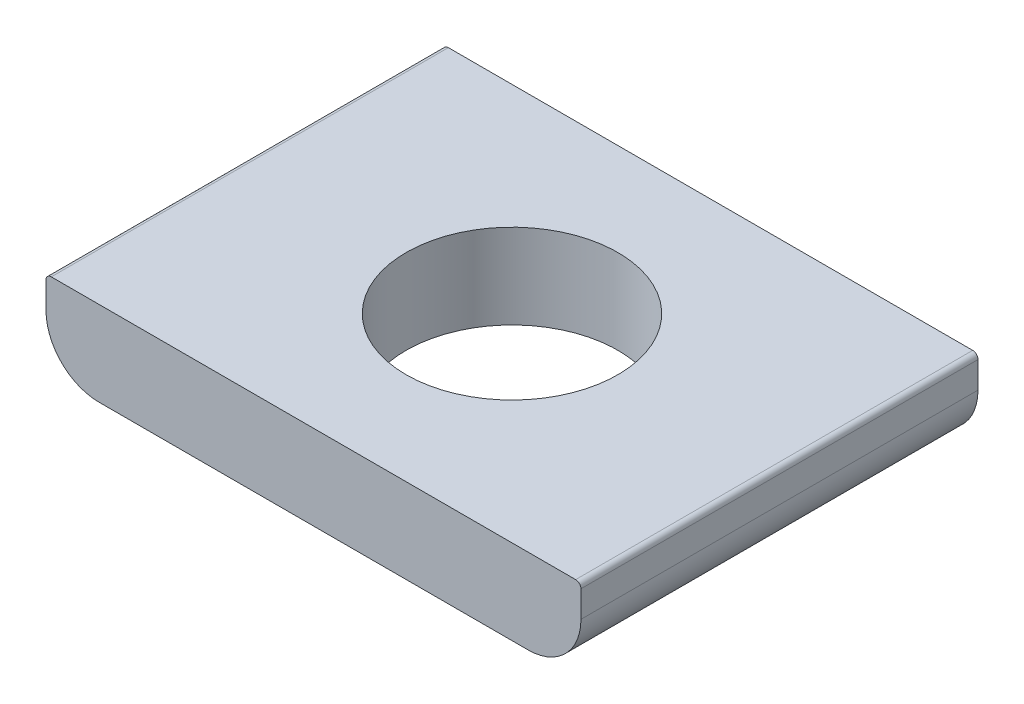
ISO-10303-21;
HEADER;
FILE_DESCRIPTION(('STEP AP214'),'2;1');
FILE_NAME('part.step','',(''),(''),'','','');
FILE_SCHEMA(('AUTOMOTIVE_DESIGN { 1 0 10303 214 1 1 1 1 }'));
ENDSEC;
DATA;
#1=APPLICATION_CONTEXT('core data for automotive mechanical design processes');
#2=APPLICATION_PROTOCOL_DEFINITION('international standard','automotive_design',2000,#1);
#3=PRODUCT_CONTEXT('',#1,'mechanical');
#4=PRODUCT('Part','Part','',(#3));
#5=PRODUCT_RELATED_PRODUCT_CATEGORY('part','',(#4));
#6=PRODUCT_DEFINITION_FORMATION('','',#4);
#7=PRODUCT_DEFINITION_CONTEXT('part definition',#1,'design');
#8=PRODUCT_DEFINITION('design','',#6,#7);
#9=PRODUCT_DEFINITION_SHAPE('','',#8);
#10=(LENGTH_UNIT() NAMED_UNIT(*) SI_UNIT(.MILLI.,.METRE.));
#11=(NAMED_UNIT(*) PLANE_ANGLE_UNIT() SI_UNIT($,.RADIAN.));
#12=(NAMED_UNIT(*) SI_UNIT($,.STERADIAN.) SOLID_ANGLE_UNIT());
#13=UNCERTAINTY_MEASURE_WITH_UNIT(LENGTH_MEASURE(1.E-05),#10,'distance_accuracy_value','');
#14=(GEOMETRIC_REPRESENTATION_CONTEXT(3) GLOBAL_UNCERTAINTY_ASSIGNED_CONTEXT((#13)) GLOBAL_UNIT_ASSIGNED_CONTEXT((#10,
#11,#12)) REPRESENTATION_CONTEXT('',''));
#15=CARTESIAN_POINT('',(0.,0.,0.));
#16=DIRECTION('',(0.,0.,1.));
#17=DIRECTION('',(1.,0.,0.));
#18=AXIS2_PLACEMENT_3D('',#15,#16,#17);
#19=CARTESIAN_POINT('',(-9.905,-0.2,15.));
#20=DIRECTION('',(0.,0.,-1.));
#21=DIRECTION('',(-1.,0.,0.));
#22=AXIS2_PLACEMENT_3D('',#19,#20,#21);
#23=CYLINDRICAL_SURFACE('',#22,0.2);
#24=CARTESIAN_POINT('',(-9.905,-0.2,0.));
#25=DIRECTION('',(0.,0.,1.));
#26=DIRECTION('',(1.,0.,0.));
#27=AXIS2_PLACEMENT_3D('',#24,#25,#26);
#28=CIRCLE('',#27,0.2);
#29=CARTESIAN_POINT('',(-9.905,0.,0.));
#30=VERTEX_POINT('',#29);
#31=CARTESIAN_POINT('',(-10.105,-0.200000000000001,0.));
#32=VERTEX_POINT('',#31);
#33=EDGE_CURVE('E129',#30,#32,#28,.T.);
#34=ORIENTED_EDGE('',*,*,#33,.T.);
#35=DIRECTION('',(0.,0.,-1.));
#36=VECTOR('',#35,1.);
#37=CARTESIAN_POINT('',(-10.105,-0.200000000000001,15.));
#38=LINE('',#37,#36);
#39=CARTESIAN_POINT('',(-10.105,-0.200000000000001,15.));
#40=VERTEX_POINT('',#39);
#41=EDGE_CURVE('E11',#40,#32,#38,.T.);
#42=ORIENTED_EDGE('',*,*,#41,.F.);
#43=CARTESIAN_POINT('',(-9.905,-0.2,15.));
#44=DIRECTION('',(0.,0.,1.));
#45=DIRECTION('',(1.,0.,0.));
#46=AXIS2_PLACEMENT_3D('',#43,#44,#45);
#47=CIRCLE('',#46,0.2);
#48=CARTESIAN_POINT('',(-9.905,0.,15.));
#49=VERTEX_POINT('',#48);
#50=EDGE_CURVE('E144',#49,#40,#47,.T.);
#51=ORIENTED_EDGE('',*,*,#50,.F.);
#52=DIRECTION('',(0.,0.,-1.));
#53=VECTOR('',#52,1.);
#54=CARTESIAN_POINT('',(-9.905,0.,15.));
#55=LINE('',#54,#53);
#56=EDGE_CURVE('E125',#49,#30,#55,.T.);
#57=ORIENTED_EDGE('',*,*,#56,.T.);
#58=EDGE_LOOP('',(#34,#42,#51,#57));
#59=FACE_BOUND('',#58,.T.);
#60=ADVANCED_FACE('F33',(#59),#23,.T.);
#61=CARTESIAN_POINT('',(-10.105,-0.200000000000001,15.));
#62=DIRECTION('',(1.,0.,0.));
#63=DIRECTION('',(0.,0.,-1.));
#64=AXIS2_PLACEMENT_3D('',#61,#62,#63);
#65=PLANE('',#64);
#66=DIRECTION('',(0.,-1.,0.));
#67=VECTOR('',#66,1.);
#68=CARTESIAN_POINT('',(-10.105,-0.200000000000001,0.));
#69=LINE('',#68,#67);
#70=CARTESIAN_POINT('',(-10.105,-1.2,0.));
#71=VERTEX_POINT('',#70);
#72=EDGE_CURVE('E132',#32,#71,#69,.T.);
#73=ORIENTED_EDGE('',*,*,#72,.T.);
#74=DIRECTION('',(0.,0.,-1.));
#75=VECTOR('',#74,1.);
#76=CARTESIAN_POINT('',(-10.105,-1.2,15.));
#77=LINE('',#76,#75);
#78=CARTESIAN_POINT('',(-10.105,-1.2,15.));
#79=VERTEX_POINT('',#78);
#80=EDGE_CURVE('E41',#79,#71,#77,.T.);
#81=ORIENTED_EDGE('',*,*,#80,.F.);
#82=DIRECTION('',(0.,-1.,0.));
#83=VECTOR('',#82,1.);
#84=CARTESIAN_POINT('',(-10.105,-0.200000000000001,15.));
#85=LINE('',#84,#83);
#86=EDGE_CURVE('E92',#40,#79,#85,.T.);
#87=ORIENTED_EDGE('',*,*,#86,.F.);
#88=ORIENTED_EDGE('',*,*,#41,.T.);
#89=EDGE_LOOP('',(#73,#81,#87,#88));
#90=FACE_BOUND('',#89,.T.);
#91=ADVANCED_FACE('F196',(#90),#65,.F.);
#92=CARTESIAN_POINT('',(-8.105,-1.2,15.));
#93=DIRECTION('',(0.,0.,-1.));
#94=DIRECTION('',(-1.,0.,0.));
#95=AXIS2_PLACEMENT_3D('',#92,#93,#94);
#96=CYLINDRICAL_SURFACE('',#95,2.);
#97=CARTESIAN_POINT('',(-8.105,-1.2,0.));
#98=DIRECTION('',(0.,0.,1.));
#99=DIRECTION('',(-1.,0.,0.));
#100=AXIS2_PLACEMENT_3D('',#97,#98,#99);
#101=CIRCLE('',#100,2.);
#102=CARTESIAN_POINT('',(-8.10499999999999,-3.2,0.));
#103=VERTEX_POINT('',#102);
#104=EDGE_CURVE('E135',#71,#103,#101,.T.);
#105=ORIENTED_EDGE('',*,*,#104,.T.);
#106=DIRECTION('',(0.,0.,-1.));
#107=VECTOR('',#106,1.);
#108=CARTESIAN_POINT('',(-8.10499999999999,-3.2,15.));
#109=LINE('',#108,#107);
#110=CARTESIAN_POINT('',(-8.10499999999999,-3.2,15.));
#111=VERTEX_POINT('',#110);
#112=EDGE_CURVE('E151',#111,#103,#109,.T.);
#113=ORIENTED_EDGE('',*,*,#112,.F.);
#114=CARTESIAN_POINT('',(-8.105,-1.2,15.));
#115=DIRECTION('',(0.,0.,1.));
#116=DIRECTION('',(-1.,0.,0.));
#117=AXIS2_PLACEMENT_3D('',#114,#115,#116);
#118=CIRCLE('',#117,2.);
#119=EDGE_CURVE('E159',#79,#111,#118,.T.);
#120=ORIENTED_EDGE('',*,*,#119,.F.);
#121=ORIENTED_EDGE('',*,*,#80,.T.);
#122=EDGE_LOOP('',(#105,#113,#120,#121));
#123=FACE_BOUND('',#122,.T.);
#124=ADVANCED_FACE('F157',(#123),#96,.T.);
#125=CARTESIAN_POINT('',(-8.10499999999999,-3.2,15.));
#126=DIRECTION('',(0.,1.,0.));
#127=DIRECTION('',(0.,0.,1.));
#128=AXIS2_PLACEMENT_3D('',#125,#126,#127);
#129=PLANE('',#128);
#130=CARTESIAN_POINT('',(0.,-3.2,7.5));
#131=DIRECTION('',(0.,1.,0.));
#132=DIRECTION('',(0.,0.,1.));
#133=AXIS2_PLACEMENT_3D('',#130,#131,#132);
#134=CIRCLE('',#133,4.);
#135=CARTESIAN_POINT('',(0.,-3.2,11.5));
#136=VERTEX_POINT('',#135);
#137=EDGE_CURVE('E133',#136,#136,#134,.T.);
#138=ORIENTED_EDGE('',*,*,#137,.T.);
#139=EDGE_LOOP('',(#138));
#140=FACE_BOUND('',#139,.T.);
#141=DIRECTION('',(1.,0.,0.));
#142=VECTOR('',#141,1.);
#143=CARTESIAN_POINT('',(-8.10499999999999,-3.2,0.));
#144=LINE('',#143,#142);
#145=CARTESIAN_POINT('',(8.10499999999999,-3.2,0.));
#146=VERTEX_POINT('',#145);
#147=EDGE_CURVE('E137',#103,#146,#144,.T.);
#148=ORIENTED_EDGE('',*,*,#147,.T.);
#149=DIRECTION('',(0.,0.,-1.));
#150=VECTOR('',#149,1.);
#151=CARTESIAN_POINT('',(8.10499999999999,-3.2,15.));
#152=LINE('',#151,#150);
#153=CARTESIAN_POINT('',(8.10499999999999,-3.2,15.));
#154=VERTEX_POINT('',#153);
#155=EDGE_CURVE('E148',#154,#146,#152,.T.);
#156=ORIENTED_EDGE('',*,*,#155,.F.);
#157=DIRECTION('',(1.,0.,0.));
#158=VECTOR('',#157,1.);
#159=CARTESIAN_POINT('',(-8.10499999999999,-3.2,15.));
#160=LINE('',#159,#158);
#161=EDGE_CURVE('E171',#111,#154,#160,.T.);
#162=ORIENTED_EDGE('',*,*,#161,.F.);
#163=ORIENTED_EDGE('',*,*,#112,.T.);
#164=EDGE_LOOP('',(#148,#156,#162,#163));
#165=FACE_BOUND('',#164,.T.);
#166=ADVANCED_FACE('F167',(#140,#165),#129,.F.);
#167=CARTESIAN_POINT('',(8.105,-1.2,15.));
#168=DIRECTION('',(0.,0.,-1.));
#169=DIRECTION('',(-1.,0.,0.));
#170=AXIS2_PLACEMENT_3D('',#167,#168,#169);
#171=CYLINDRICAL_SURFACE('',#170,2.);
#172=CARTESIAN_POINT('',(8.105,-1.2,0.));
#173=DIRECTION('',(0.,0.,1.));
#174=DIRECTION('',(1.,0.,0.));
#175=AXIS2_PLACEMENT_3D('',#172,#173,#174);
#176=CIRCLE('',#175,2.);
#177=CARTESIAN_POINT('',(10.105,-1.19999999999999,0.));
#178=VERTEX_POINT('',#177);
#179=EDGE_CURVE('E139',#146,#178,#176,.T.);
#180=ORIENTED_EDGE('',*,*,#179,.T.);
#181=DIRECTION('',(0.,0.,-1.));
#182=VECTOR('',#181,1.);
#183=CARTESIAN_POINT('',(10.105,-1.19999999999999,15.));
#184=LINE('',#183,#182);
#185=CARTESIAN_POINT('',(10.105,-1.19999999999999,15.));
#186=VERTEX_POINT('',#185);
#187=EDGE_CURVE('E120',#186,#178,#184,.T.);
#188=ORIENTED_EDGE('',*,*,#187,.F.);
#189=CARTESIAN_POINT('',(8.105,-1.2,15.));
#190=DIRECTION('',(0.,0.,1.));
#191=DIRECTION('',(1.,0.,0.));
#192=AXIS2_PLACEMENT_3D('',#189,#190,#191);
#193=CIRCLE('',#192,2.);
#194=EDGE_CURVE('E111',#154,#186,#193,.T.);
#195=ORIENTED_EDGE('',*,*,#194,.F.);
#196=ORIENTED_EDGE('',*,*,#155,.T.);
#197=EDGE_LOOP('',(#180,#188,#195,#196));
#198=FACE_BOUND('',#197,.T.);
#199=ADVANCED_FACE('F170',(#198),#171,.T.);
#200=CARTESIAN_POINT('',(10.105,-0.200000000000001,15.));
#201=DIRECTION('',(-1.,0.,0.));
#202=DIRECTION('',(0.,0.,1.));
#203=AXIS2_PLACEMENT_3D('',#200,#201,#202);
#204=PLANE('',#203);
#205=DIRECTION('',(0.,1.,0.));
#206=VECTOR('',#205,1.);
#207=CARTESIAN_POINT('',(10.105,-0.200000000000001,0.));
#208=LINE('',#207,#206);
#209=CARTESIAN_POINT('',(10.105,-0.200000000000001,0.));
#210=VERTEX_POINT('',#209);
#211=EDGE_CURVE('E119',#178,#210,#208,.T.);
#212=ORIENTED_EDGE('',*,*,#211,.T.);
#213=DIRECTION('',(0.,0.,-1.));
#214=VECTOR('',#213,1.);
#215=CARTESIAN_POINT('',(10.105,-0.200000000000001,15.));
#216=LINE('',#215,#214);
#217=CARTESIAN_POINT('',(10.105,-0.200000000000001,15.));
#218=VERTEX_POINT('',#217);
#219=EDGE_CURVE('E116',#218,#210,#216,.T.);
#220=ORIENTED_EDGE('',*,*,#219,.F.);
#221=DIRECTION('',(0.,1.,0.));
#222=VECTOR('',#221,1.);
#223=CARTESIAN_POINT('',(10.105,-0.200000000000001,15.));
#224=LINE('',#223,#222);
#225=EDGE_CURVE('E105',#186,#218,#224,.T.);
#226=ORIENTED_EDGE('',*,*,#225,.F.);
#227=ORIENTED_EDGE('',*,*,#187,.T.);
#228=EDGE_LOOP('',(#212,#220,#226,#227));
#229=FACE_BOUND('',#228,.T.);
#230=ADVANCED_FACE('F117',(#229),#204,.F.);
#231=CARTESIAN_POINT('',(9.905,-0.2,15.));
#232=DIRECTION('',(0.,0.,-1.));
#233=DIRECTION('',(-1.,0.,0.));
#234=AXIS2_PLACEMENT_3D('',#231,#232,#233);
#235=CYLINDRICAL_SURFACE('',#234,0.2);
#236=CARTESIAN_POINT('',(9.905,-0.2,0.));
#237=DIRECTION('',(0.,0.,1.));
#238=DIRECTION('',(-1.,0.,0.));
#239=AXIS2_PLACEMENT_3D('',#236,#237,#238);
#240=CIRCLE('',#239,0.2);
#241=CARTESIAN_POINT('',(9.905,0.,0.));
#242=VERTEX_POINT('',#241);
#243=EDGE_CURVE('E78',#210,#242,#240,.T.);
#244=ORIENTED_EDGE('',*,*,#243,.T.);
#245=DIRECTION('',(0.,0.,-1.));
#246=VECTOR('',#245,1.);
#247=CARTESIAN_POINT('',(9.905,0.,15.));
#248=LINE('',#247,#246);
#249=CARTESIAN_POINT('',(9.905,0.,15.));
#250=VERTEX_POINT('',#249);
#251=EDGE_CURVE('E121',#250,#242,#248,.T.);
#252=ORIENTED_EDGE('',*,*,#251,.F.);
#253=CARTESIAN_POINT('',(9.905,-0.2,15.));
#254=DIRECTION('',(0.,0.,1.));
#255=DIRECTION('',(-1.,0.,0.));
#256=AXIS2_PLACEMENT_3D('',#253,#254,#255);
#257=CIRCLE('',#256,0.2);
#258=EDGE_CURVE('E109',#218,#250,#257,.T.);
#259=ORIENTED_EDGE('',*,*,#258,.F.);
#260=ORIENTED_EDGE('',*,*,#219,.T.);
#261=EDGE_LOOP('',(#244,#252,#259,#260));
#262=FACE_BOUND('',#261,.T.);
#263=ADVANCED_FACE('F123',(#262),#235,.T.);
#264=CARTESIAN_POINT('',(9.905,0.,15.));
#265=DIRECTION('',(0.,-1.,0.));
#266=DIRECTION('',(0.,0.,-1.));
#267=AXIS2_PLACEMENT_3D('',#264,#265,#266);
#268=PLANE('',#267);
#269=CARTESIAN_POINT('',(0.,0.,7.5));
#270=DIRECTION('',(0.,1.,0.));
#271=DIRECTION('',(0.,0.,1.));
#272=AXIS2_PLACEMENT_3D('',#269,#270,#271);
#273=CIRCLE('',#272,3.99999999999999);
#274=CARTESIAN_POINT('',(0.,0.,11.5));
#275=VERTEX_POINT('',#274);
#276=EDGE_CURVE('E179',#275,#275,#273,.T.);
#277=ORIENTED_EDGE('',*,*,#276,.F.);
#278=EDGE_LOOP('',(#277));
#279=FACE_BOUND('',#278,.T.);
#280=DIRECTION('',(-1.,0.,0.));
#281=VECTOR('',#280,1.);
#282=CARTESIAN_POINT('',(9.905,0.,0.));
#283=LINE('',#282,#281);
#284=EDGE_CURVE('E84',#242,#30,#283,.T.);
#285=ORIENTED_EDGE('',*,*,#284,.T.);
#286=ORIENTED_EDGE('',*,*,#56,.F.);
#287=DIRECTION('',(-1.,0.,0.));
#288=VECTOR('',#287,1.);
#289=CARTESIAN_POINT('',(9.905,0.,15.));
#290=LINE('',#289,#288);
#291=EDGE_CURVE('E49',#250,#49,#290,.T.);
#292=ORIENTED_EDGE('',*,*,#291,.F.);
#293=ORIENTED_EDGE('',*,*,#251,.T.);
#294=EDGE_LOOP('',(#285,#286,#292,#293));
#295=FACE_BOUND('',#294,.T.);
#296=ADVANCED_FACE('F185',(#279,#295),#268,.F.);
#297=CARTESIAN_POINT('',(-9.905,-0.2,15.));
#298=DIRECTION('',(0.,0.,1.));
#299=DIRECTION('',(1.,0.,0.));
#300=AXIS2_PLACEMENT_3D('',#297,#298,#299);
#301=PLANE('',#300);
#302=ORIENTED_EDGE('',*,*,#50,.T.);
#303=ORIENTED_EDGE('',*,*,#86,.T.);
#304=ORIENTED_EDGE('',*,*,#119,.T.);
#305=ORIENTED_EDGE('',*,*,#161,.T.);
#306=ORIENTED_EDGE('',*,*,#194,.T.);
#307=ORIENTED_EDGE('',*,*,#225,.T.);
#308=ORIENTED_EDGE('',*,*,#258,.T.);
#309=ORIENTED_EDGE('',*,*,#291,.T.);
#310=EDGE_LOOP('',(#302,#303,#304,#305,#306,#307,#308,#309));
#311=FACE_BOUND('',#310,.T.);
#312=ADVANCED_FACE('F107',(#311),#301,.T.);
#313=CARTESIAN_POINT('',(-9.905,-0.2,0.));
#314=DIRECTION('',(0.,0.,1.));
#315=DIRECTION('',(1.,0.,0.));
#316=AXIS2_PLACEMENT_3D('',#313,#314,#315);
#317=PLANE('',#316);
#318=ORIENTED_EDGE('',*,*,#33,.F.);
#319=ORIENTED_EDGE('',*,*,#284,.F.);
#320=ORIENTED_EDGE('',*,*,#243,.F.);
#321=ORIENTED_EDGE('',*,*,#211,.F.);
#322=ORIENTED_EDGE('',*,*,#179,.F.);
#323=ORIENTED_EDGE('',*,*,#147,.F.);
#324=ORIENTED_EDGE('',*,*,#104,.F.);
#325=ORIENTED_EDGE('',*,*,#72,.F.);
#326=EDGE_LOOP('',(#318,#319,#320,#321,#322,#323,#324,#325));
#327=FACE_BOUND('',#326,.T.);
#328=ADVANCED_FACE('F163',(#327),#317,.F.);
#329=CARTESIAN_POINT('',(0.,0.,7.5));
#330=DIRECTION('',(0.,1.,0.));
#331=DIRECTION('',(0.,0.,1.));
#332=AXIS2_PLACEMENT_3D('',#329,#330,#331);
#333=CYLINDRICAL_SURFACE('',#332,3.99999999999999);
#334=ORIENTED_EDGE('',*,*,#137,.F.);
#335=EDGE_LOOP('',(#334));
#336=FACE_BOUND('',#335,.T.);
#337=ORIENTED_EDGE('',*,*,#276,.T.);
#338=EDGE_LOOP('',(#337));
#339=FACE_BOUND('',#338,.T.);
#340=ADVANCED_FACE('F183',(#336,#339),#333,.F.);
#341=CLOSED_SHELL('',(#60,#91,#124,#166,#199,#230,#263,#296,#312,#328,#340));
#342=MANIFOLD_SOLID_BREP('B2',#341);
#343=ADVANCED_BREP_SHAPE_REPRESENTATION('',(#18,#342),#14);
#344=SHAPE_DEFINITION_REPRESENTATION(#9,#343);
ENDSEC;
END-ISO-10303-21;
